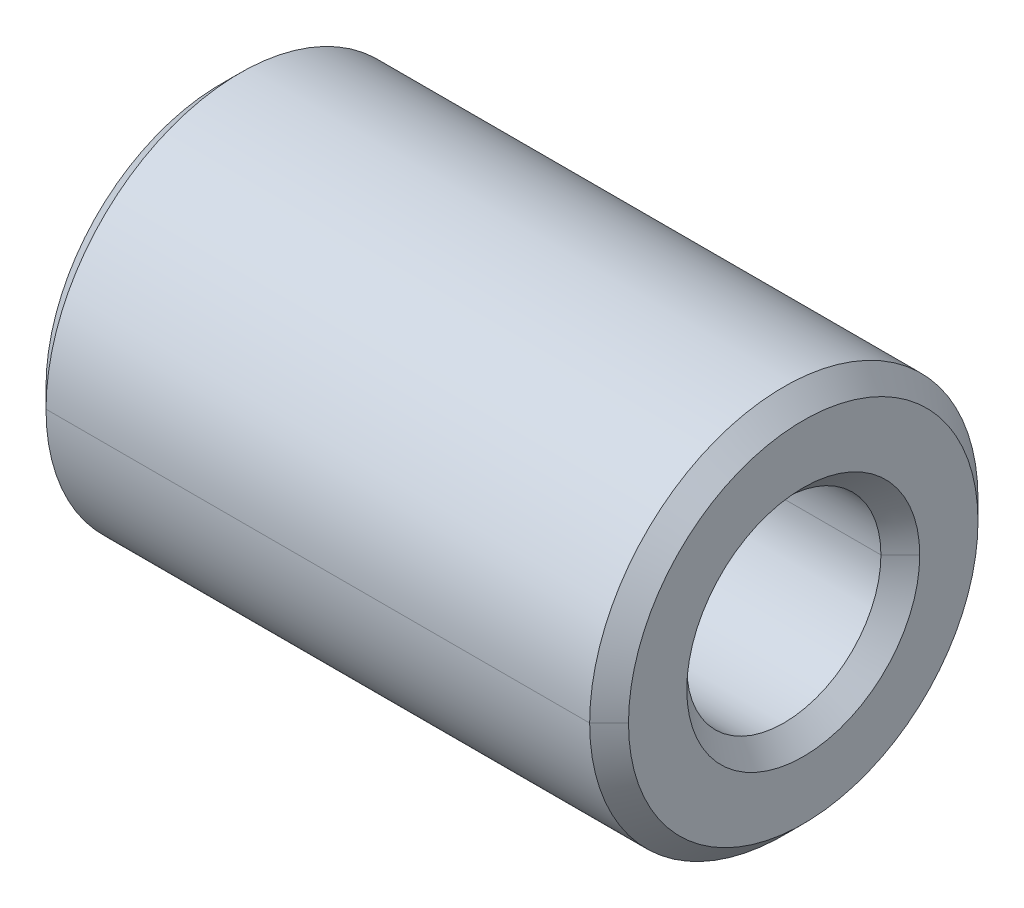
ISO-10303-21;
HEADER;
FILE_DESCRIPTION(('STEP AP214'),'2;1');
FILE_NAME('part.step','',(''),(''),'','','');
FILE_SCHEMA(('AUTOMOTIVE_DESIGN { 1 0 10303 214 1 1 1 1 }'));
ENDSEC;
DATA;
#1=APPLICATION_CONTEXT('core data for automotive mechanical design processes');
#2=APPLICATION_PROTOCOL_DEFINITION('international standard','automotive_design',2000,#1);
#3=PRODUCT_CONTEXT('',#1,'mechanical');
#4=PRODUCT('Part','Part','',(#3));
#5=PRODUCT_RELATED_PRODUCT_CATEGORY('part','',(#4));
#6=PRODUCT_DEFINITION_FORMATION('','',#4);
#7=PRODUCT_DEFINITION_CONTEXT('part definition',#1,'design');
#8=PRODUCT_DEFINITION('design','',#6,#7);
#9=PRODUCT_DEFINITION_SHAPE('','',#8);
#10=(LENGTH_UNIT() NAMED_UNIT(*) SI_UNIT(.MILLI.,.METRE.));
#11=(NAMED_UNIT(*) PLANE_ANGLE_UNIT() SI_UNIT($,.RADIAN.));
#12=(NAMED_UNIT(*) SI_UNIT($,.STERADIAN.) SOLID_ANGLE_UNIT());
#13=UNCERTAINTY_MEASURE_WITH_UNIT(LENGTH_MEASURE(1.E-05),#10,'distance_accuracy_value','');
#14=(GEOMETRIC_REPRESENTATION_CONTEXT(3) GLOBAL_UNCERTAINTY_ASSIGNED_CONTEXT((#13)) GLOBAL_UNIT_ASSIGNED_CONTEXT((#10,
#11,#12)) REPRESENTATION_CONTEXT('',''));
#15=CARTESIAN_POINT('',(0.,0.,0.));
#16=DIRECTION('',(0.,0.,1.));
#17=DIRECTION('',(1.,0.,0.));
#18=AXIS2_PLACEMENT_3D('',#15,#16,#17);
#19=CARTESIAN_POINT('',(211217.907113383,8888.40771416165,-2.4456131564321E-11));
#20=DIRECTION('',(-1.,0.,0.));
#21=DIRECTION('',(0.,0.,1.));
#22=AXIS2_PLACEMENT_3D('',#19,#20,#21);
#23=CYLINDRICAL_SURFACE('',#22,1.00000000000034);
#24=CARTESIAN_POINT('',(211225.207113384,8888.40771416165,-1.7878060143417E-11));
#25=DIRECTION('',(-1.,0.,0.));
#26=DIRECTION('',(0.,0.,1.));
#27=AXIS2_PLACEMENT_3D('',#24,#25,#26);
#28=CIRCLE('',#27,1.00000000000122);
#29=CARTESIAN_POINT('',(211225.207113384,8888.40771416165,-1.0000000000191));
#30=VERTEX_POINT('',#29);
#31=CARTESIAN_POINT('',(211225.207113384,8888.40771416165,0.999999999983344));
#32=VERTEX_POINT('',#31);
#33=EDGE_CURVE('E142',#30,#32,#28,.T.);
#34=ORIENTED_EDGE('',*,*,#33,.F.);
#35=DIRECTION('',(-1.,0.,0.));
#36=VECTOR('',#35,1.);
#37=CARTESIAN_POINT('',(211217.907113383,8888.40771416165,-1.00000000002479));
#38=LINE('',#37,#36);
#39=CARTESIAN_POINT('',(211219.607113383,8888.40771416165,-0.99999999999394));
#40=VERTEX_POINT('',#39);
#41=EDGE_CURVE('E11',#30,#40,#38,.T.);
#42=ORIENTED_EDGE('',*,*,#41,.T.);
#43=CARTESIAN_POINT('',(211219.607113383,8888.40771416165,5.50601231275039E-12));
#44=DIRECTION('',(-1.,0.,0.));
#45=DIRECTION('',(0.,0.,1.));
#46=AXIS2_PLACEMENT_3D('',#43,#44,#45);
#47=CIRCLE('',#46,0.999999999999448);
#48=CARTESIAN_POINT('',(211219.607113383,8888.40771416165,1.00000000000495));
#49=VERTEX_POINT('',#48);
#50=EDGE_CURVE('E26',#40,#49,#47,.T.);
#51=ORIENTED_EDGE('',*,*,#50,.T.);
#52=DIRECTION('',(-1.,0.,0.));
#53=VECTOR('',#52,1.);
#54=CARTESIAN_POINT('',(211217.907113383,8888.40771416165,0.99999999997588));
#55=LINE('',#54,#53);
#56=EDGE_CURVE('E178',#32,#49,#55,.T.);
#57=ORIENTED_EDGE('',*,*,#56,.F.);
#58=EDGE_LOOP('',(#34,#42,#51,#57));
#59=FACE_BOUND('',#58,.T.);
#60=ADVANCED_FACE('F16',(#59),#23,.F.);
#61=CARTESIAN_POINT('',(211219.407113384,8888.40771416165,8.76382300063483E-11));
#62=DIRECTION('',(-1.,0.,0.));
#63=DIRECTION('',(0.,0.,1.));
#64=AXIS2_PLACEMENT_3D('',#61,#62,#63);
#65=CONICAL_SURFACE('',#64,1.20000000000076,0.785398163384126);
#66=ORIENTED_EDGE('',*,*,#50,.F.);
#67=DIRECTION('',(-0.707106781195968,0.,-0.707106781177127));
#68=VECTOR('',#67,1.);
#69=CARTESIAN_POINT('',(211219.407113384,8888.40771416165,-1.19999999991312));
#70=LINE('',#69,#68);
#71=CARTESIAN_POINT('',(211219.407113384,8888.40771416165,-1.19999999991312));
#72=VERTEX_POINT('',#71);
#73=EDGE_CURVE('E54',#40,#72,#70,.T.);
#74=ORIENTED_EDGE('',*,*,#73,.T.);
#75=CARTESIAN_POINT('',(211219.407113384,8888.40771416165,8.76382300063483E-11));
#76=DIRECTION('',(-1.,0.,0.));
#77=DIRECTION('',(0.,0.,1.));
#78=AXIS2_PLACEMENT_3D('',#75,#76,#77);
#79=CIRCLE('',#78,1.20000000000076);
#80=CARTESIAN_POINT('',(211219.407113384,8888.40771416165,1.2000000000884));
#81=VERTEX_POINT('',#80);
#82=EDGE_CURVE('E75',#72,#81,#79,.T.);
#83=ORIENTED_EDGE('',*,*,#82,.T.);
#84=DIRECTION('',(-0.707106781195968,0.,0.707106781177127));
#85=VECTOR('',#84,1.);
#86=CARTESIAN_POINT('',(211219.407113384,8888.40771416165,1.2000000000884));
#87=LINE('',#86,#85);
#88=EDGE_CURVE('E85',#49,#81,#87,.T.);
#89=ORIENTED_EDGE('',*,*,#88,.F.);
#90=EDGE_LOOP('',(#66,#74,#83,#89));
#91=FACE_BOUND('',#90,.T.);
#92=ADVANCED_FACE('F376',(#91),#65,.F.);
#93=CARTESIAN_POINT('',(211219.407113384,8888.40771416165,-1.43669798280399E-11));
#94=DIRECTION('',(1.,0.,0.));
#95=DIRECTION('',(0.,0.,-1.));
#96=AXIS2_PLACEMENT_3D('',#93,#94,#95);
#97=CONICAL_SURFACE('',#96,1.79999999999759,0.785398163379684);
#98=CARTESIAN_POINT('',(211219.407113384,8888.40771416165,-1.43669798280399E-11));
#99=DIRECTION('',(-1.,0.,0.));
#100=DIRECTION('',(0.,0.,1.));
#101=AXIS2_PLACEMENT_3D('',#98,#99,#100);
#102=CIRCLE('',#101,1.79999999999759);
#103=CARTESIAN_POINT('',(211219.407113384,8888.40771416165,1.79999999998322));
#104=VERTEX_POINT('',#103);
#105=CARTESIAN_POINT('',(211219.407113384,8888.40771416165,-1.80000000001195));
#106=VERTEX_POINT('',#105);
#107=EDGE_CURVE('E180',#104,#106,#102,.T.);
#108=ORIENTED_EDGE('',*,*,#107,.F.);
#109=DIRECTION('',(0.707106781199108,0.,0.707106781173987));
#110=VECTOR('',#109,1.);
#111=CARTESIAN_POINT('',(211219.407113384,8888.40771416165,1.79999999998322));
#112=LINE('',#111,#110);
#113=CARTESIAN_POINT('',(211219.607113383,8888.40771416165,2.00000000000263));
#114=VERTEX_POINT('',#113);
#115=EDGE_CURVE('E189',#104,#114,#112,.T.);
#116=ORIENTED_EDGE('',*,*,#115,.T.);
#117=CARTESIAN_POINT('',(211219.607113383,8888.40771416165,5.50601231275039E-12));
#118=DIRECTION('',(-1.,0.,0.));
#119=DIRECTION('',(0.,0.,1.));
#120=AXIS2_PLACEMENT_3D('',#117,#118,#119);
#121=CIRCLE('',#120,1.99999999999712);
#122=CARTESIAN_POINT('',(211219.607113383,8888.40771416165,-1.99999999999161));
#123=VERTEX_POINT('',#122);
#124=EDGE_CURVE('E162',#114,#123,#121,.T.);
#125=ORIENTED_EDGE('',*,*,#124,.T.);
#126=DIRECTION('',(0.707106781199109,0.,-0.707106781173987));
#127=VECTOR('',#126,1.);
#128=CARTESIAN_POINT('',(211219.407113384,8888.40771416165,-1.80000000001195));
#129=LINE('',#128,#127);
#130=EDGE_CURVE('E174',#106,#123,#129,.T.);
#131=ORIENTED_EDGE('',*,*,#130,.F.);
#132=EDGE_LOOP('',(#108,#116,#125,#131));
#133=FACE_BOUND('',#132,.T.);
#134=ADVANCED_FACE('F396',(#133),#97,.T.);
#135=CARTESIAN_POINT('',(211217.907113383,8888.40771416165,-2.4456131564321E-11));
#136=DIRECTION('',(-1.,0.,0.));
#137=DIRECTION('',(0.,0.,1.));
#138=AXIS2_PLACEMENT_3D('',#135,#136,#137);
#139=CYLINDRICAL_SURFACE('',#138,1.99999999999712);
#140=CARTESIAN_POINT('',(211225.207113384,8888.40771416165,-1.7878060143417E-11));
#141=DIRECTION('',(-1.,0.,0.));
#142=DIRECTION('',(0.,0.,1.));
#143=AXIS2_PLACEMENT_3D('',#140,#141,#142);
#144=CIRCLE('',#143,1.99999999999712);
#145=CARTESIAN_POINT('',(211225.207113384,8888.40771416165,1.99999999997924));
#146=VERTEX_POINT('',#145);
#147=CARTESIAN_POINT('',(211225.207113384,8888.40771416165,-2.000000000015));
#148=VERTEX_POINT('',#147);
#149=EDGE_CURVE('E133',#146,#148,#144,.T.);
#150=ORIENTED_EDGE('',*,*,#149,.T.);
#151=DIRECTION('',(-1.,0.,0.));
#152=VECTOR('',#151,1.);
#153=CARTESIAN_POINT('',(211217.907113383,8888.40771416165,-2.00000000002158));
#154=LINE('',#153,#152);
#155=EDGE_CURVE('E147',#148,#123,#154,.T.);
#156=ORIENTED_EDGE('',*,*,#155,.T.);
#157=ORIENTED_EDGE('',*,*,#124,.F.);
#158=DIRECTION('',(-1.,0.,0.));
#159=VECTOR('',#158,1.);
#160=CARTESIAN_POINT('',(211217.907113383,8888.40771416165,1.99999999997267));
#161=LINE('',#160,#159);
#162=EDGE_CURVE('E159',#146,#114,#161,.T.);
#163=ORIENTED_EDGE('',*,*,#162,.F.);
#164=EDGE_LOOP('',(#150,#156,#157,#163));
#165=FACE_BOUND('',#164,.T.);
#166=ADVANCED_FACE('F158',(#165),#139,.T.);
#167=CARTESIAN_POINT('',(211225.207113384,8888.40771416165,-1.7878060143417E-11));
#168=DIRECTION('',(-1.,0.,0.));
#169=DIRECTION('',(0.,0.,1.));
#170=AXIS2_PLACEMENT_3D('',#167,#168,#169);
#171=CONICAL_SURFACE('',#170,1.99999999999712,0.785398163379684);
#172=CARTESIAN_POINT('',(211225.407113384,8888.40771416165,1.73784597823357E-11));
#173=DIRECTION('',(-1.,0.,0.));
#174=DIRECTION('',(0.,0.,1.));
#175=AXIS2_PLACEMENT_3D('',#172,#173,#174);
#176=CIRCLE('',#175,1.79999999999759);
#177=CARTESIAN_POINT('',(211225.407113384,8888.40771416165,1.80000000001496));
#178=VERTEX_POINT('',#177);
#179=CARTESIAN_POINT('',(211225.407113384,8888.40771416165,-1.7999999999802));
#180=VERTEX_POINT('',#179);
#181=EDGE_CURVE('E136',#178,#180,#176,.T.);
#182=ORIENTED_EDGE('',*,*,#181,.T.);
#183=DIRECTION('',(-0.707106781199108,0.,-0.707106781173987));
#184=VECTOR('',#183,1.);
#185=CARTESIAN_POINT('',(211225.207113384,8888.40771416165,-2.000000000015));
#186=LINE('',#185,#184);
#187=EDGE_CURVE('E129',#180,#148,#186,.T.);
#188=ORIENTED_EDGE('',*,*,#187,.T.);
#189=ORIENTED_EDGE('',*,*,#149,.F.);
#190=DIRECTION('',(-0.707106781199109,0.,0.707106781173987));
#191=VECTOR('',#190,1.);
#192=CARTESIAN_POINT('',(211225.207113384,8888.40771416165,1.99999999997924));
#193=LINE('',#192,#191);
#194=EDGE_CURVE('E164',#178,#146,#193,.T.);
#195=ORIENTED_EDGE('',*,*,#194,.F.);
#196=EDGE_LOOP('',(#182,#188,#189,#195));
#197=FACE_BOUND('',#196,.T.);
#198=ADVANCED_FACE('F131',(#197),#171,.T.);
#199=CARTESIAN_POINT('',(211225.207113384,8888.40771416165,-1.7878060143417E-11));
#200=DIRECTION('',(1.,0.,0.));
#201=DIRECTION('',(0.,0.,-1.));
#202=AXIS2_PLACEMENT_3D('',#199,#200,#201);
#203=CONICAL_SURFACE('',#202,1.00000000000122,0.785398163384126);
#204=ORIENTED_EDGE('',*,*,#33,.T.);
#205=DIRECTION('',(0.707106781195968,0.,0.707106781177127));
#206=VECTOR('',#205,1.);
#207=CARTESIAN_POINT('',(211225.207113384,8888.40771416165,0.999999999983346));
#208=LINE('',#207,#206);
#209=CARTESIAN_POINT('',(211225.407113384,8888.40771416165,1.20000000001308));
#210=VERTEX_POINT('',#209);
#211=EDGE_CURVE('E194',#32,#210,#208,.T.);
#212=ORIENTED_EDGE('',*,*,#211,.T.);
#213=CARTESIAN_POINT('',(211225.407113384,8888.40771416165,1.73784597823357E-11));
#214=DIRECTION('',(-1.,0.,0.));
#215=DIRECTION('',(0.,0.,1.));
#216=AXIS2_PLACEMENT_3D('',#213,#214,#215);
#217=CIRCLE('',#216,1.20000000000253);
#218=CARTESIAN_POINT('',(211225.407113384,8888.40771416165,-1.20000000004883));
#219=VERTEX_POINT('',#218);
#220=EDGE_CURVE('E113',#219,#210,#217,.T.);
#221=ORIENTED_EDGE('',*,*,#220,.F.);
#222=DIRECTION('',(0.707106781195968,0.,-0.707106781177127));
#223=VECTOR('',#222,1.);
#224=CARTESIAN_POINT('',(211225.207113384,8888.40771416165,-1.0000000000191));
#225=LINE('',#224,#223);
#226=EDGE_CURVE('E40',#30,#219,#225,.T.);
#227=ORIENTED_EDGE('',*,*,#226,.F.);
#228=EDGE_LOOP('',(#204,#212,#221,#227));
#229=FACE_BOUND('',#228,.T.);
#230=ADVANCED_FACE('F400',(#229),#203,.F.);
#231=CARTESIAN_POINT('',(211225.207113384,8888.40771416165,-1.7878060143417E-11));
#232=DIRECTION('',(1.,0.,0.));
#233=DIRECTION('',(0.,0.,-1.));
#234=AXIS2_PLACEMENT_3D('',#231,#232,#233);
#235=CONICAL_SURFACE('',#234,1.00000000000122,0.785398163384126);
#236=ORIENTED_EDGE('',*,*,#211,.F.);
#237=CARTESIAN_POINT('',(211225.207113384,8888.40771416165,-1.7878060143417E-11));
#238=DIRECTION('',(-1.,0.,0.));
#239=DIRECTION('',(0.,0.,1.));
#240=AXIS2_PLACEMENT_3D('',#237,#238,#239);
#241=CIRCLE('',#240,1.00000000000122);
#242=EDGE_CURVE('E190',#32,#30,#241,.T.);
#243=ORIENTED_EDGE('',*,*,#242,.T.);
#244=ORIENTED_EDGE('',*,*,#226,.T.);
#245=CARTESIAN_POINT('',(211225.407113384,8888.40771416165,1.73784597823357E-11));
#246=DIRECTION('',(-1.,0.,0.));
#247=DIRECTION('',(0.,0.,1.));
#248=AXIS2_PLACEMENT_3D('',#245,#246,#247);
#249=CIRCLE('',#248,1.20000000000253);
#250=EDGE_CURVE('E209',#210,#219,#249,.T.);
#251=ORIENTED_EDGE('',*,*,#250,.F.);
#252=EDGE_LOOP('',(#236,#243,#244,#251));
#253=FACE_BOUND('',#252,.T.);
#254=ADVANCED_FACE('F406',(#253),#235,.F.);
#255=CARTESIAN_POINT('',(211225.407113384,8709.56037628374,1.7354173653672E-11));
#256=DIRECTION('',(-1.,0.,0.));
#257=DIRECTION('',(0.,0.,1.));
#258=AXIS2_PLACEMENT_3D('',#255,#256,#257);
#259=PLANE('',#258);
#260=ORIENTED_EDGE('',*,*,#181,.F.);
#261=CARTESIAN_POINT('',(211225.407113384,8888.40771416165,1.73784597823357E-11));
#262=DIRECTION('',(-1.,0.,0.));
#263=DIRECTION('',(0.,0.,1.));
#264=AXIS2_PLACEMENT_3D('',#261,#262,#263);
#265=CIRCLE('',#264,1.79999999999759);
#266=EDGE_CURVE('E172',#180,#178,#265,.T.);
#267=ORIENTED_EDGE('',*,*,#266,.F.);
#268=EDGE_LOOP('',(#260,#267));
#269=FACE_BOUND('',#268,.T.);
#270=ORIENTED_EDGE('',*,*,#220,.T.);
#271=ORIENTED_EDGE('',*,*,#250,.T.);
#272=EDGE_LOOP('',(#270,#271));
#273=FACE_BOUND('',#272,.T.);
#274=ADVANCED_FACE('F412',(#269,#273),#259,.F.);
#275=CARTESIAN_POINT('',(211225.207113384,8888.40771416165,-1.7878060143417E-11));
#276=DIRECTION('',(-1.,0.,0.));
#277=DIRECTION('',(0.,0.,1.));
#278=AXIS2_PLACEMENT_3D('',#275,#276,#277);
#279=CONICAL_SURFACE('',#278,1.99999999999712,0.785398163379684);
#280=ORIENTED_EDGE('',*,*,#187,.F.);
#281=ORIENTED_EDGE('',*,*,#266,.T.);
#282=ORIENTED_EDGE('',*,*,#194,.T.);
#283=CARTESIAN_POINT('',(211225.207113384,8888.40771416165,-1.7878060143417E-11));
#284=DIRECTION('',(-1.,0.,0.));
#285=DIRECTION('',(0.,0.,1.));
#286=AXIS2_PLACEMENT_3D('',#283,#284,#285);
#287=CIRCLE('',#286,1.99999999999712);
#288=EDGE_CURVE('E150',#148,#146,#287,.T.);
#289=ORIENTED_EDGE('',*,*,#288,.F.);
#290=EDGE_LOOP('',(#280,#281,#282,#289));
#291=FACE_BOUND('',#290,.T.);
#292=ADVANCED_FACE('F18',(#291),#279,.T.);
#293=CARTESIAN_POINT('',(211217.907113383,8888.40771416165,-2.4456131564321E-11));
#294=DIRECTION('',(-1.,0.,0.));
#295=DIRECTION('',(0.,0.,1.));
#296=AXIS2_PLACEMENT_3D('',#293,#294,#295);
#297=CYLINDRICAL_SURFACE('',#296,1.99999999999712);
#298=ORIENTED_EDGE('',*,*,#155,.F.);
#299=ORIENTED_EDGE('',*,*,#288,.T.);
#300=ORIENTED_EDGE('',*,*,#162,.T.);
#301=CARTESIAN_POINT('',(211219.607113383,8888.40771416165,5.50601231275039E-12));
#302=DIRECTION('',(-1.,0.,0.));
#303=DIRECTION('',(0.,0.,1.));
#304=AXIS2_PLACEMENT_3D('',#301,#302,#303);
#305=CIRCLE('',#304,1.99999999999712);
#306=EDGE_CURVE('E152',#123,#114,#305,.T.);
#307=ORIENTED_EDGE('',*,*,#306,.F.);
#308=EDGE_LOOP('',(#298,#299,#300,#307));
#309=FACE_BOUND('',#308,.T.);
#310=ADVANCED_FACE('F148',(#309),#297,.T.);
#311=CARTESIAN_POINT('',(211219.407113384,8888.40771416165,-1.43669798280399E-11));
#312=DIRECTION('',(1.,0.,0.));
#313=DIRECTION('',(0.,0.,-1.));
#314=AXIS2_PLACEMENT_3D('',#311,#312,#313);
#315=CONICAL_SURFACE('',#314,1.79999999999759,0.785398163379684);
#316=ORIENTED_EDGE('',*,*,#115,.F.);
#317=CARTESIAN_POINT('',(211219.407113384,8888.40771416165,-1.43669798280399E-11));
#318=DIRECTION('',(-1.,0.,0.));
#319=DIRECTION('',(0.,0.,1.));
#320=AXIS2_PLACEMENT_3D('',#317,#318,#319);
#321=CIRCLE('',#320,1.79999999999759);
#322=EDGE_CURVE('E20',#106,#104,#321,.T.);
#323=ORIENTED_EDGE('',*,*,#322,.F.);
#324=ORIENTED_EDGE('',*,*,#130,.T.);
#325=ORIENTED_EDGE('',*,*,#306,.T.);
#326=EDGE_LOOP('',(#316,#323,#324,#325));
#327=FACE_BOUND('',#326,.T.);
#328=ADVANCED_FACE('F387',(#327),#315,.T.);
#329=CARTESIAN_POINT('',(211219.407113384,8709.56037628374,-6.15132944581376E-12));
#330=DIRECTION('',(-1.,0.,0.));
#331=DIRECTION('',(0.,0.,1.));
#332=AXIS2_PLACEMENT_3D('',#329,#330,#331);
#333=PLANE('',#332);
#334=ORIENTED_EDGE('',*,*,#322,.T.);
#335=ORIENTED_EDGE('',*,*,#107,.T.);
#336=EDGE_LOOP('',(#334,#335));
#337=FACE_BOUND('',#336,.T.);
#338=CARTESIAN_POINT('',(211219.407113384,8888.40771416165,8.76382300063483E-11));
#339=DIRECTION('',(-1.,0.,0.));
#340=DIRECTION('',(0.,0.,1.));
#341=AXIS2_PLACEMENT_3D('',#338,#339,#340);
#342=CIRCLE('',#341,1.20000000000076);
#343=EDGE_CURVE('E198',#81,#72,#342,.T.);
#344=ORIENTED_EDGE('',*,*,#343,.F.);
#345=ORIENTED_EDGE('',*,*,#82,.F.);
#346=EDGE_LOOP('',(#344,#345));
#347=FACE_BOUND('',#346,.T.);
#348=ADVANCED_FACE('F379',(#337,#347),#333,.T.);
#349=CARTESIAN_POINT('',(211219.407113384,8888.40771416165,8.76382300063483E-11));
#350=DIRECTION('',(-1.,0.,0.));
#351=DIRECTION('',(0.,0.,1.));
#352=AXIS2_PLACEMENT_3D('',#349,#350,#351);
#353=CONICAL_SURFACE('',#352,1.20000000000076,0.785398163384126);
#354=ORIENTED_EDGE('',*,*,#73,.F.);
#355=CARTESIAN_POINT('',(211219.607113383,8888.40771416165,5.50601231275039E-12));
#356=DIRECTION('',(-1.,0.,0.));
#357=DIRECTION('',(0.,0.,1.));
#358=AXIS2_PLACEMENT_3D('',#355,#356,#357);
#359=CIRCLE('',#358,0.999999999999448);
#360=EDGE_CURVE('E183',#49,#40,#359,.T.);
#361=ORIENTED_EDGE('',*,*,#360,.F.);
#362=ORIENTED_EDGE('',*,*,#88,.T.);
#363=ORIENTED_EDGE('',*,*,#343,.T.);
#364=EDGE_LOOP('',(#354,#361,#362,#363));
#365=FACE_BOUND('',#364,.T.);
#366=ADVANCED_FACE('F377',(#365),#353,.F.);
#367=CARTESIAN_POINT('',(211217.907113383,8888.40771416165,-2.4456131564321E-11));
#368=DIRECTION('',(-1.,0.,0.));
#369=DIRECTION('',(0.,0.,1.));
#370=AXIS2_PLACEMENT_3D('',#367,#368,#369);
#371=CYLINDRICAL_SURFACE('',#370,1.00000000000034);
#372=ORIENTED_EDGE('',*,*,#41,.F.);
#373=ORIENTED_EDGE('',*,*,#242,.F.);
#374=ORIENTED_EDGE('',*,*,#56,.T.);
#375=ORIENTED_EDGE('',*,*,#360,.T.);
#376=EDGE_LOOP('',(#372,#373,#374,#375));
#377=FACE_BOUND('',#376,.T.);
#378=ADVANCED_FACE('F372',(#377),#371,.F.);
#379=CLOSED_SHELL('',(#60,#92,#134,#166,#198,#230,#254,#274,#292,#310,#328,#348,#366,#378));
#380=MANIFOLD_SOLID_BREP('B1',#379);
#381=ADVANCED_BREP_SHAPE_REPRESENTATION('',(#18,#380),#14);
#382=SHAPE_DEFINITION_REPRESENTATION(#9,#381);
ENDSEC;
END-ISO-10303-21;
